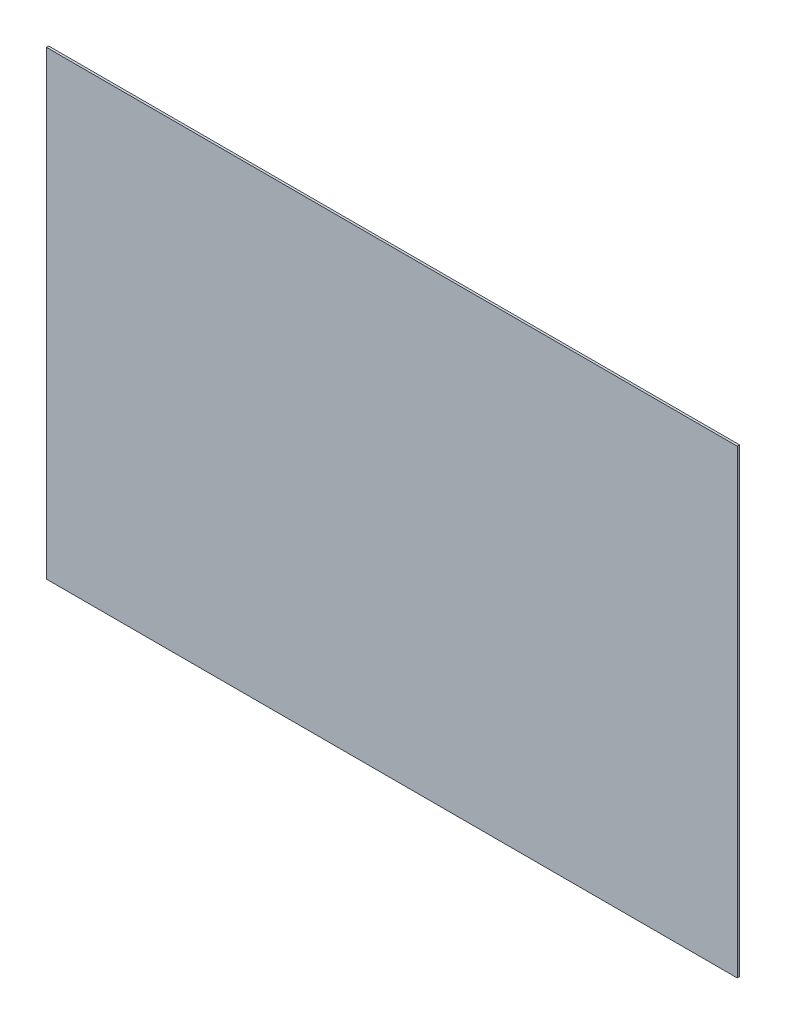
ISO-10303-21;
HEADER;
FILE_DESCRIPTION(('STEP AP214'),'2;1');
FILE_NAME('part.step','',(''),(''),'','','');
FILE_SCHEMA(('AUTOMOTIVE_DESIGN { 1 0 10303 214 1 1 1 1 }'));
ENDSEC;
DATA;
#1=APPLICATION_CONTEXT('core data for automotive mechanical design processes');
#2=APPLICATION_PROTOCOL_DEFINITION('international standard','automotive_design',2000,#1);
#3=PRODUCT_CONTEXT('',#1,'mechanical');
#4=PRODUCT('Part','Part','',(#3));
#5=PRODUCT_RELATED_PRODUCT_CATEGORY('part','',(#4));
#6=PRODUCT_DEFINITION_FORMATION('','',#4);
#7=PRODUCT_DEFINITION_CONTEXT('part definition',#1,'design');
#8=PRODUCT_DEFINITION('design','',#6,#7);
#9=PRODUCT_DEFINITION_SHAPE('','',#8);
#10=(LENGTH_UNIT() NAMED_UNIT(*) SI_UNIT(.MILLI.,.METRE.));
#11=(NAMED_UNIT(*) PLANE_ANGLE_UNIT() SI_UNIT($,.RADIAN.));
#12=(NAMED_UNIT(*) SI_UNIT($,.STERADIAN.) SOLID_ANGLE_UNIT());
#13=UNCERTAINTY_MEASURE_WITH_UNIT(LENGTH_MEASURE(1.E-05),#10,'distance_accuracy_value','');
#14=(GEOMETRIC_REPRESENTATION_CONTEXT(3) GLOBAL_UNCERTAINTY_ASSIGNED_CONTEXT((#13)) GLOBAL_UNIT_ASSIGNED_CONTEXT((#10,
#11,#12)) REPRESENTATION_CONTEXT('',''));
#15=CARTESIAN_POINT('',(0.,0.,0.));
#16=DIRECTION('',(0.,0.,1.));
#17=DIRECTION('',(1.,0.,0.));
#18=AXIS2_PLACEMENT_3D('',#15,#16,#17);
#19=CARTESIAN_POINT('',(0.,0.,2.));
#20=DIRECTION('',(-1.,0.,0.));
#21=DIRECTION('',(0.,-1.,0.));
#22=AXIS2_PLACEMENT_3D('',#19,#20,#21);
#23=PLANE('',#22);
#24=DIRECTION('',(0.,1.,0.));
#25=VECTOR('',#24,1.);
#26=CARTESIAN_POINT('',(0.,0.,0.));
#27=LINE('',#26,#25);
#28=CARTESIAN_POINT('',(0.,0.,0.));
#29=VERTEX_POINT('',#28);
#30=CARTESIAN_POINT('',(0.,400.,0.));
#31=VERTEX_POINT('',#30);
#32=EDGE_CURVE('E95',#29,#31,#27,.T.);
#33=ORIENTED_EDGE('',*,*,#32,.T.);
#34=DIRECTION('',(0.,0.,-1.));
#35=VECTOR('',#34,1.);
#36=CARTESIAN_POINT('',(0.,400.,2.));
#37=LINE('',#36,#35);
#38=CARTESIAN_POINT('',(0.,400.,2.));
#39=VERTEX_POINT('',#38);
#40=EDGE_CURVE('E11',#39,#31,#37,.T.);
#41=ORIENTED_EDGE('',*,*,#40,.F.);
#42=DIRECTION('',(0.,1.,0.));
#43=VECTOR('',#42,1.);
#44=CARTESIAN_POINT('',(0.,0.,2.));
#45=LINE('',#44,#43);
#46=CARTESIAN_POINT('',(0.,0.,2.));
#47=VERTEX_POINT('',#46);
#48=EDGE_CURVE('E83',#47,#39,#45,.T.);
#49=ORIENTED_EDGE('',*,*,#48,.F.);
#50=DIRECTION('',(0.,0.,-1.));
#51=VECTOR('',#50,1.);
#52=CARTESIAN_POINT('',(0.,0.,2.));
#53=LINE('',#52,#51);
#54=EDGE_CURVE('E91',#47,#29,#53,.T.);
#55=ORIENTED_EDGE('',*,*,#54,.T.);
#56=EDGE_LOOP('',(#33,#41,#49,#55));
#57=FACE_BOUND('',#56,.T.);
#58=ADVANCED_FACE('F32',(#57),#23,.F.);
#59=CARTESIAN_POINT('',(0.,400.,2.));
#60=DIRECTION('',(0.,-1.,0.));
#61=DIRECTION('',(1.,0.,0.));
#62=AXIS2_PLACEMENT_3D('',#59,#60,#61);
#63=PLANE('',#62);
#64=DIRECTION('',(-1.,0.,0.));
#65=VECTOR('',#64,1.);
#66=CARTESIAN_POINT('',(0.,400.,0.));
#67=LINE('',#66,#65);
#68=CARTESIAN_POINT('',(-600.,400.,0.));
#69=VERTEX_POINT('',#68);
#70=EDGE_CURVE('E87',#31,#69,#67,.T.);
#71=ORIENTED_EDGE('',*,*,#70,.T.);
#72=DIRECTION('',(0.,0.,-1.));
#73=VECTOR('',#72,1.);
#74=CARTESIAN_POINT('',(-600.,400.,2.));
#75=LINE('',#74,#73);
#76=CARTESIAN_POINT('',(-600.,400.,2.));
#77=VERTEX_POINT('',#76);
#78=EDGE_CURVE('E40',#77,#69,#75,.T.);
#79=ORIENTED_EDGE('',*,*,#78,.F.);
#80=DIRECTION('',(-1.,0.,0.));
#81=VECTOR('',#80,1.);
#82=CARTESIAN_POINT('',(0.,400.,2.));
#83=LINE('',#82,#81);
#84=EDGE_CURVE('E78',#39,#77,#83,.T.);
#85=ORIENTED_EDGE('',*,*,#84,.F.);
#86=ORIENTED_EDGE('',*,*,#40,.T.);
#87=EDGE_LOOP('',(#71,#79,#85,#86));
#88=FACE_BOUND('',#87,.T.);
#89=ADVANCED_FACE('F86',(#88),#63,.F.);
#90=CARTESIAN_POINT('',(-600.,0.,2.));
#91=DIRECTION('',(1.,0.,0.));
#92=DIRECTION('',(0.,0.,-1.));
#93=AXIS2_PLACEMENT_3D('',#90,#91,#92);
#94=PLANE('',#93);
#95=DIRECTION('',(0.,-1.,0.));
#96=VECTOR('',#95,1.);
#97=CARTESIAN_POINT('',(-600.,0.,0.));
#98=LINE('',#97,#96);
#99=CARTESIAN_POINT('',(-600.,0.,0.));
#100=VERTEX_POINT('',#99);
#101=EDGE_CURVE('E65',#69,#100,#98,.T.);
#102=ORIENTED_EDGE('',*,*,#101,.T.);
#103=DIRECTION('',(0.,0.,-1.));
#104=VECTOR('',#103,1.);
#105=CARTESIAN_POINT('',(-600.,0.,2.));
#106=LINE('',#105,#104);
#107=CARTESIAN_POINT('',(-600.,0.,2.));
#108=VERTEX_POINT('',#107);
#109=EDGE_CURVE('E88',#108,#100,#106,.T.);
#110=ORIENTED_EDGE('',*,*,#109,.F.);
#111=DIRECTION('',(0.,-1.,0.));
#112=VECTOR('',#111,1.);
#113=CARTESIAN_POINT('',(-600.,0.,2.));
#114=LINE('',#113,#112);
#115=EDGE_CURVE('E81',#77,#108,#114,.T.);
#116=ORIENTED_EDGE('',*,*,#115,.F.);
#117=ORIENTED_EDGE('',*,*,#78,.T.);
#118=EDGE_LOOP('',(#102,#110,#116,#117));
#119=FACE_BOUND('',#118,.T.);
#120=ADVANCED_FACE('F89',(#119),#94,.F.);
#121=CARTESIAN_POINT('',(0.,0.,2.));
#122=DIRECTION('',(0.,1.,0.));
#123=DIRECTION('',(0.,0.,1.));
#124=AXIS2_PLACEMENT_3D('',#121,#122,#123);
#125=PLANE('',#124);
#126=DIRECTION('',(1.,0.,0.));
#127=VECTOR('',#126,1.);
#128=CARTESIAN_POINT('',(0.,0.,0.));
#129=LINE('',#128,#127);
#130=EDGE_CURVE('E71',#100,#29,#129,.T.);
#131=ORIENTED_EDGE('',*,*,#130,.T.);
#132=ORIENTED_EDGE('',*,*,#54,.F.);
#133=DIRECTION('',(1.,0.,0.));
#134=VECTOR('',#133,1.);
#135=CARTESIAN_POINT('',(0.,0.,2.));
#136=LINE('',#135,#134);
#137=EDGE_CURVE('E48',#108,#47,#136,.T.);
#138=ORIENTED_EDGE('',*,*,#137,.F.);
#139=ORIENTED_EDGE('',*,*,#109,.T.);
#140=EDGE_LOOP('',(#131,#132,#138,#139));
#141=FACE_BOUND('',#140,.T.);
#142=ADVANCED_FACE('F102',(#141),#125,.F.);
#143=CARTESIAN_POINT('',(0.,0.,2.));
#144=DIRECTION('',(0.,0.,1.));
#145=DIRECTION('',(1.,0.,0.));
#146=AXIS2_PLACEMENT_3D('',#143,#144,#145);
#147=PLANE('',#146);
#148=ORIENTED_EDGE('',*,*,#48,.T.);
#149=ORIENTED_EDGE('',*,*,#84,.T.);
#150=ORIENTED_EDGE('',*,*,#115,.T.);
#151=ORIENTED_EDGE('',*,*,#137,.T.);
#152=EDGE_LOOP('',(#148,#149,#150,#151));
#153=FACE_BOUND('',#152,.T.);
#154=ADVANCED_FACE('F79',(#153),#147,.T.);
#155=CARTESIAN_POINT('',(0.,0.,0.));
#156=DIRECTION('',(0.,0.,1.));
#157=DIRECTION('',(1.,0.,0.));
#158=AXIS2_PLACEMENT_3D('',#155,#156,#157);
#159=PLANE('',#158);
#160=ORIENTED_EDGE('',*,*,#32,.F.);
#161=ORIENTED_EDGE('',*,*,#130,.F.);
#162=ORIENTED_EDGE('',*,*,#101,.F.);
#163=ORIENTED_EDGE('',*,*,#70,.F.);
#164=EDGE_LOOP('',(#160,#161,#162,#163));
#165=FACE_BOUND('',#164,.T.);
#166=ADVANCED_FACE('F105',(#165),#159,.F.);
#167=CLOSED_SHELL('',(#58,#89,#120,#142,#154,#166));
#168=MANIFOLD_SOLID_BREP('B2',#167);
#169=ADVANCED_BREP_SHAPE_REPRESENTATION('',(#18,#168),#14);
#170=SHAPE_DEFINITION_REPRESENTATION(#9,#169);
ENDSEC;
END-ISO-10303-21;
